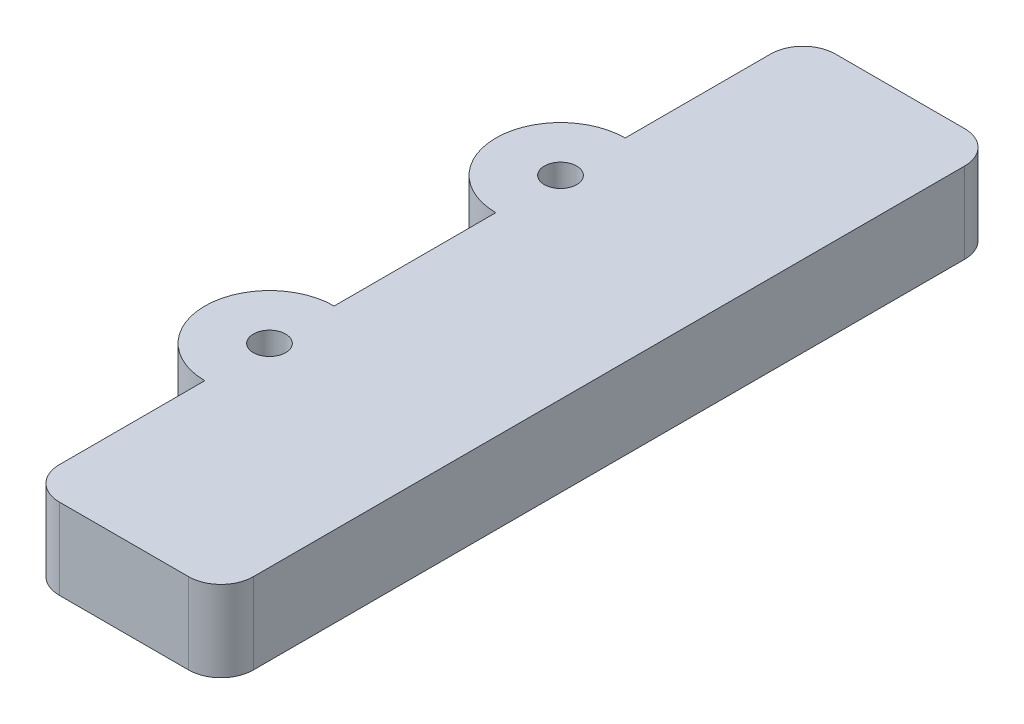
ISO-10303-21;
HEADER;
FILE_DESCRIPTION(('STEP AP214'),'2;1');
FILE_NAME('part.step','',(''),(''),'','','');
FILE_SCHEMA(('AUTOMOTIVE_DESIGN { 1 0 10303 214 1 1 1 1 }'));
ENDSEC;
DATA;
#1=APPLICATION_CONTEXT('core data for automotive mechanical design processes');
#2=APPLICATION_PROTOCOL_DEFINITION('international standard','automotive_design',2000,#1);
#3=PRODUCT_CONTEXT('',#1,'mechanical');
#4=PRODUCT('Part','Part','',(#3));
#5=PRODUCT_RELATED_PRODUCT_CATEGORY('part','',(#4));
#6=PRODUCT_DEFINITION_FORMATION('','',#4);
#7=PRODUCT_DEFINITION_CONTEXT('part definition',#1,'design');
#8=PRODUCT_DEFINITION('design','',#6,#7);
#9=PRODUCT_DEFINITION_SHAPE('','',#8);
#10=(LENGTH_UNIT() NAMED_UNIT(*) SI_UNIT(.MILLI.,.METRE.));
#11=(NAMED_UNIT(*) PLANE_ANGLE_UNIT() SI_UNIT($,.RADIAN.));
#12=(NAMED_UNIT(*) SI_UNIT($,.STERADIAN.) SOLID_ANGLE_UNIT());
#13=UNCERTAINTY_MEASURE_WITH_UNIT(LENGTH_MEASURE(1.E-05),#10,'distance_accuracy_value','');
#14=(GEOMETRIC_REPRESENTATION_CONTEXT(3) GLOBAL_UNCERTAINTY_ASSIGNED_CONTEXT((#13)) GLOBAL_UNIT_ASSIGNED_CONTEXT((#10,
#11,#12)) REPRESENTATION_CONTEXT('',''));
#15=CARTESIAN_POINT('',(0.,0.,0.));
#16=DIRECTION('',(0.,0.,1.));
#17=DIRECTION('',(1.,0.,0.));
#18=AXIS2_PLACEMENT_3D('',#15,#16,#17);
#19=CARTESIAN_POINT('',(0.,5.,-33.));
#20=DIRECTION('',(0.,1.,0.));
#21=DIRECTION('',(0.,0.,1.));
#22=AXIS2_PLACEMENT_3D('',#19,#20,#21);
#23=PLANE('',#22);
#24=CARTESIAN_POINT('',(0.,5.,-33.));
#25=DIRECTION('',(0.,1.,0.));
#26=DIRECTION('',(0.,0.,1.));
#27=AXIS2_PLACEMENT_3D('',#24,#25,#26);
#28=CIRCLE('',#27,1.);
#29=CARTESIAN_POINT('',(0.,5.,-32.));
#30=VERTEX_POINT('',#29);
#31=EDGE_CURVE('E161',#30,#30,#28,.T.);
#32=ORIENTED_EDGE('',*,*,#31,.F.);
#33=EDGE_LOOP('',(#32));
#34=FACE_BOUND('',#33,.T.);
#35=DIRECTION('',(0.,0.,1.));
#36=VECTOR('',#35,1.);
#37=CARTESIAN_POINT('',(0.,5.,0.));
#38=LINE('',#37,#36);
#39=CARTESIAN_POINT('',(0.,5.,-11.));
#40=VERTEX_POINT('',#39);
#41=CARTESIAN_POINT('',(0.,5.,-2.));
#42=VERTEX_POINT('',#41);
#43=EDGE_CURVE('E151',#40,#42,#38,.T.);
#44=ORIENTED_EDGE('',*,*,#43,.T.);
#45=CARTESIAN_POINT('',(2.,5.,-2.));
#46=DIRECTION('',(0.,1.,0.));
#47=DIRECTION('',(0.,0.,1.));
#48=AXIS2_PLACEMENT_3D('',#45,#46,#47);
#49=CIRCLE('',#48,2.);
#50=CARTESIAN_POINT('',(2.,5.,0.));
#51=VERTEX_POINT('',#50);
#52=EDGE_CURVE('E202',#42,#51,#49,.T.);
#53=ORIENTED_EDGE('',*,*,#52,.T.);
#54=DIRECTION('',(1.,0.,0.));
#55=VECTOR('',#54,1.);
#56=CARTESIAN_POINT('',(0.,5.,0.));
#57=LINE('',#56,#55);
#58=CARTESIAN_POINT('',(10.,5.,0.));
#59=VERTEX_POINT('',#58);
#60=EDGE_CURVE('E153',#51,#59,#57,.T.);
#61=ORIENTED_EDGE('',*,*,#60,.T.);
#62=CARTESIAN_POINT('',(10.,5.,-2.));
#63=DIRECTION('',(0.,1.,0.));
#64=DIRECTION('',(0.,0.,1.));
#65=AXIS2_PLACEMENT_3D('',#62,#63,#64);
#66=CIRCLE('',#65,2.);
#67=CARTESIAN_POINT('',(12.,5.,-2.));
#68=VERTEX_POINT('',#67);
#69=EDGE_CURVE('E200',#59,#68,#66,.T.);
#70=ORIENTED_EDGE('',*,*,#69,.T.);
#71=DIRECTION('',(0.,0.,-1.));
#72=VECTOR('',#71,1.);
#73=CARTESIAN_POINT('',(12.,5.,0.));
#74=LINE('',#73,#72);
#75=CARTESIAN_POINT('',(12.,5.,-46.));
#76=VERTEX_POINT('',#75);
#77=EDGE_CURVE('E176',#68,#76,#74,.T.);
#78=ORIENTED_EDGE('',*,*,#77,.T.);
#79=CARTESIAN_POINT('',(10.,5.,-46.));
#80=DIRECTION('',(0.,1.,0.));
#81=DIRECTION('',(0.,0.,1.));
#82=AXIS2_PLACEMENT_3D('',#79,#80,#81);
#83=CIRCLE('',#82,2.);
#84=CARTESIAN_POINT('',(10.,5.,-48.));
#85=VERTEX_POINT('',#84);
#86=EDGE_CURVE('E197',#76,#85,#83,.T.);
#87=ORIENTED_EDGE('',*,*,#86,.T.);
#88=DIRECTION('',(-1.,0.,0.));
#89=VECTOR('',#88,1.);
#90=CARTESIAN_POINT('',(0.,5.,-48.));
#91=LINE('',#90,#89);
#92=CARTESIAN_POINT('',(2.,5.,-48.));
#93=VERTEX_POINT('',#92);
#94=EDGE_CURVE('E129',#85,#93,#91,.T.);
#95=ORIENTED_EDGE('',*,*,#94,.T.);
#96=CARTESIAN_POINT('',(2.,5.,-46.));
#97=DIRECTION('',(0.,1.,0.));
#98=DIRECTION('',(0.,0.,1.));
#99=AXIS2_PLACEMENT_3D('',#96,#97,#98);
#100=CIRCLE('',#99,2.);
#101=CARTESIAN_POINT('',(0.,5.,-46.));
#102=VERTEX_POINT('',#101);
#103=EDGE_CURVE('E48',#93,#102,#100,.T.);
#104=ORIENTED_EDGE('',*,*,#103,.T.);
#105=DIRECTION('',(0.,0.,1.));
#106=VECTOR('',#105,1.);
#107=CARTESIAN_POINT('',(0.,5.,-37.));
#108=LINE('',#107,#106);
#109=CARTESIAN_POINT('',(0.,5.,-37.));
#110=VERTEX_POINT('',#109);
#111=EDGE_CURVE('E119',#102,#110,#108,.T.);
#112=ORIENTED_EDGE('',*,*,#111,.T.);
#113=CARTESIAN_POINT('',(0.,5.,-33.));
#114=DIRECTION('',(0.,1.,0.));
#115=DIRECTION('',(0.,0.,1.));
#116=AXIS2_PLACEMENT_3D('',#113,#114,#115);
#117=CIRCLE('',#116,4.);
#118=CARTESIAN_POINT('',(0.,5.,-29.));
#119=VERTEX_POINT('',#118);
#120=EDGE_CURVE('E124',#110,#119,#117,.T.);
#121=ORIENTED_EDGE('',*,*,#120,.T.);
#122=DIRECTION('',(0.,0.,1.));
#123=VECTOR('',#122,1.);
#124=CARTESIAN_POINT('',(0.,5.,-19.));
#125=LINE('',#124,#123);
#126=CARTESIAN_POINT('',(0.,5.,-19.));
#127=VERTEX_POINT('',#126);
#128=EDGE_CURVE('E144',#119,#127,#125,.T.);
#129=ORIENTED_EDGE('',*,*,#128,.T.);
#130=CARTESIAN_POINT('',(0.,5.,-15.));
#131=DIRECTION('',(0.,1.,0.));
#132=DIRECTION('',(0.,0.,1.));
#133=AXIS2_PLACEMENT_3D('',#130,#131,#132);
#134=CIRCLE('',#133,4.);
#135=EDGE_CURVE('E146',#127,#40,#134,.T.);
#136=ORIENTED_EDGE('',*,*,#135,.T.);
#137=EDGE_LOOP('',(#44,#53,#61,#70,#78,#87,#95,#104,#112,#121,#129,#136));
#138=FACE_BOUND('',#137,.T.);
#139=CARTESIAN_POINT('',(0.,5.,-15.));
#140=DIRECTION('',(0.,1.,0.));
#141=DIRECTION('',(0.,0.,1.));
#142=AXIS2_PLACEMENT_3D('',#139,#140,#141);
#143=CIRCLE('',#142,1.);
#144=CARTESIAN_POINT('',(0.,5.,-14.));
#145=VERTEX_POINT('',#144);
#146=EDGE_CURVE('E293',#145,#145,#143,.T.);
#147=ORIENTED_EDGE('',*,*,#146,.F.);
#148=EDGE_LOOP('',(#147));
#149=FACE_BOUND('',#148,.T.);
#150=ADVANCED_FACE('F33',(#34,#138,#149),#23,.T.);
#151=CARTESIAN_POINT('',(0.,0.,-33.));
#152=DIRECTION('',(0.,1.,0.));
#153=DIRECTION('',(0.,0.,1.));
#154=AXIS2_PLACEMENT_3D('',#151,#152,#153);
#155=PLANE('',#154);
#156=DIRECTION('',(1.,0.,0.));
#157=VECTOR('',#156,1.);
#158=CARTESIAN_POINT('',(0.,0.,0.));
#159=LINE('',#158,#157);
#160=CARTESIAN_POINT('',(2.,0.,0.));
#161=VERTEX_POINT('',#160);
#162=CARTESIAN_POINT('',(10.,0.,0.));
#163=VERTEX_POINT('',#162);
#164=EDGE_CURVE('E173',#161,#163,#159,.T.);
#165=ORIENTED_EDGE('',*,*,#164,.F.);
#166=CARTESIAN_POINT('',(2.,0.,-2.));
#167=DIRECTION('',(0.,1.,0.));
#168=DIRECTION('',(0.,0.,1.));
#169=AXIS2_PLACEMENT_3D('',#166,#167,#168);
#170=CIRCLE('',#169,2.);
#171=CARTESIAN_POINT('',(0.,0.,-2.));
#172=VERTEX_POINT('',#171);
#173=EDGE_CURVE('E193',#161,#172,#170,.F.);
#174=ORIENTED_EDGE('',*,*,#173,.T.);
#175=DIRECTION('',(0.,0.,1.));
#176=VECTOR('',#175,1.);
#177=CARTESIAN_POINT('',(0.,0.,0.));
#178=LINE('',#177,#176);
#179=CARTESIAN_POINT('',(0.,0.,-11.));
#180=VERTEX_POINT('',#179);
#181=EDGE_CURVE('E170',#180,#172,#178,.T.);
#182=ORIENTED_EDGE('',*,*,#181,.F.);
#183=CARTESIAN_POINT('',(0.,0.,-15.));
#184=DIRECTION('',(0.,1.,0.));
#185=DIRECTION('',(0.,0.,1.));
#186=AXIS2_PLACEMENT_3D('',#183,#184,#185);
#187=CIRCLE('',#186,4.);
#188=CARTESIAN_POINT('',(0.,0.,-19.));
#189=VERTEX_POINT('',#188);
#190=EDGE_CURVE('E168',#189,#180,#187,.T.);
#191=ORIENTED_EDGE('',*,*,#190,.F.);
#192=DIRECTION('',(0.,0.,1.));
#193=VECTOR('',#192,1.);
#194=CARTESIAN_POINT('',(0.,0.,-19.));
#195=LINE('',#194,#193);
#196=CARTESIAN_POINT('',(0.,0.,-29.));
#197=VERTEX_POINT('',#196);
#198=EDGE_CURVE('E166',#197,#189,#195,.T.);
#199=ORIENTED_EDGE('',*,*,#198,.F.);
#200=CARTESIAN_POINT('',(0.,0.,-33.));
#201=DIRECTION('',(0.,1.,0.));
#202=DIRECTION('',(0.,0.,1.));
#203=AXIS2_PLACEMENT_3D('',#200,#201,#202);
#204=CIRCLE('',#203,4.);
#205=CARTESIAN_POINT('',(0.,0.,-37.));
#206=VERTEX_POINT('',#205);
#207=EDGE_CURVE('E164',#206,#197,#204,.T.);
#208=ORIENTED_EDGE('',*,*,#207,.F.);
#209=DIRECTION('',(0.,0.,1.));
#210=VECTOR('',#209,1.);
#211=CARTESIAN_POINT('',(0.,0.,-37.));
#212=LINE('',#211,#210);
#213=CARTESIAN_POINT('',(0.,0.,-46.));
#214=VERTEX_POINT('',#213);
#215=EDGE_CURVE('E135',#214,#206,#212,.T.);
#216=ORIENTED_EDGE('',*,*,#215,.F.);
#217=CARTESIAN_POINT('',(2.,0.,-46.));
#218=DIRECTION('',(0.,1.,0.));
#219=DIRECTION('',(0.,0.,1.));
#220=AXIS2_PLACEMENT_3D('',#217,#218,#219);
#221=CIRCLE('',#220,2.);
#222=CARTESIAN_POINT('',(2.,0.,-48.));
#223=VERTEX_POINT('',#222);
#224=EDGE_CURVE('E189',#214,#223,#221,.F.);
#225=ORIENTED_EDGE('',*,*,#224,.T.);
#226=DIRECTION('',(-1.,0.,0.));
#227=VECTOR('',#226,1.);
#228=CARTESIAN_POINT('',(0.,0.,-48.));
#229=LINE('',#228,#227);
#230=CARTESIAN_POINT('',(10.,0.,-48.));
#231=VERTEX_POINT('',#230);
#232=EDGE_CURVE('E160',#231,#223,#229,.T.);
#233=ORIENTED_EDGE('',*,*,#232,.F.);
#234=CARTESIAN_POINT('',(10.,0.,-46.));
#235=DIRECTION('',(0.,1.,0.));
#236=DIRECTION('',(0.,0.,1.));
#237=AXIS2_PLACEMENT_3D('',#234,#235,#236);
#238=CIRCLE('',#237,2.);
#239=CARTESIAN_POINT('',(12.,0.,-46.));
#240=VERTEX_POINT('',#239);
#241=EDGE_CURVE('E187',#231,#240,#238,.F.);
#242=ORIENTED_EDGE('',*,*,#241,.T.);
#243=DIRECTION('',(0.,0.,-1.));
#244=VECTOR('',#243,1.);
#245=CARTESIAN_POINT('',(12.,0.,0.));
#246=LINE('',#245,#244);
#247=CARTESIAN_POINT('',(12.,0.,-2.));
#248=VERTEX_POINT('',#247);
#249=EDGE_CURVE('E157',#248,#240,#246,.T.);
#250=ORIENTED_EDGE('',*,*,#249,.F.);
#251=CARTESIAN_POINT('',(10.,0.,-2.));
#252=DIRECTION('',(0.,1.,0.));
#253=DIRECTION('',(0.,0.,1.));
#254=AXIS2_PLACEMENT_3D('',#251,#252,#253);
#255=CIRCLE('',#254,2.);
#256=EDGE_CURVE('E191',#248,#163,#255,.F.);
#257=ORIENTED_EDGE('',*,*,#256,.T.);
#258=EDGE_LOOP('',(#165,#174,#182,#191,#199,#208,#216,#225,#233,#242,#250,#257));
#259=FACE_BOUND('',#258,.T.);
#260=CARTESIAN_POINT('',(0.,0.,-33.));
#261=DIRECTION('',(0.,1.,0.));
#262=DIRECTION('',(0.,0.,1.));
#263=AXIS2_PLACEMENT_3D('',#260,#261,#262);
#264=CIRCLE('',#263,1.);
#265=CARTESIAN_POINT('',(0.,0.,-32.));
#266=VERTEX_POINT('',#265);
#267=EDGE_CURVE('E290',#266,#266,#264,.T.);
#268=ORIENTED_EDGE('',*,*,#267,.T.);
#269=EDGE_LOOP('',(#268));
#270=FACE_BOUND('',#269,.T.);
#271=CARTESIAN_POINT('',(0.,0.,-15.));
#272=DIRECTION('',(0.,1.,0.));
#273=DIRECTION('',(0.,0.,1.));
#274=AXIS2_PLACEMENT_3D('',#271,#272,#273);
#275=CIRCLE('',#274,1.);
#276=CARTESIAN_POINT('',(0.,0.,-14.));
#277=VERTEX_POINT('',#276);
#278=EDGE_CURVE('E296',#277,#277,#275,.T.);
#279=ORIENTED_EDGE('',*,*,#278,.T.);
#280=EDGE_LOOP('',(#279));
#281=FACE_BOUND('',#280,.T.);
#282=ADVANCED_FACE('F218',(#259,#270,#281),#155,.F.);
#283=CARTESIAN_POINT('',(12.,5.,0.));
#284=DIRECTION('',(-1.,0.,0.));
#285=DIRECTION('',(0.,0.,1.));
#286=AXIS2_PLACEMENT_3D('',#283,#284,#285);
#287=PLANE('',#286);
#288=ORIENTED_EDGE('',*,*,#77,.F.);
#289=DIRECTION('',(0.,-1.,0.));
#290=VECTOR('',#289,1.);
#291=CARTESIAN_POINT('',(12.,5.,-2.));
#292=LINE('',#291,#290);
#293=EDGE_CURVE('E206',#68,#248,#292,.T.);
#294=ORIENTED_EDGE('',*,*,#293,.T.);
#295=ORIENTED_EDGE('',*,*,#249,.T.);
#296=DIRECTION('',(0.,-1.,0.));
#297=VECTOR('',#296,1.);
#298=CARTESIAN_POINT('',(12.,5.,-46.));
#299=LINE('',#298,#297);
#300=EDGE_CURVE('E204',#240,#76,#299,.F.);
#301=ORIENTED_EDGE('',*,*,#300,.T.);
#302=EDGE_LOOP('',(#288,#294,#295,#301));
#303=FACE_BOUND('',#302,.T.);
#304=ADVANCED_FACE('F238',(#303),#287,.F.);
#305=CARTESIAN_POINT('',(0.,5.,-48.));
#306=DIRECTION('',(0.,0.,1.));
#307=DIRECTION('',(1.,0.,0.));
#308=AXIS2_PLACEMENT_3D('',#305,#306,#307);
#309=PLANE('',#308);
#310=ORIENTED_EDGE('',*,*,#232,.T.);
#311=DIRECTION('',(0.,-1.,0.));
#312=VECTOR('',#311,1.);
#313=CARTESIAN_POINT('',(2.,5.,-48.));
#314=LINE('',#313,#312);
#315=EDGE_CURVE('E11',#223,#93,#314,.F.);
#316=ORIENTED_EDGE('',*,*,#315,.T.);
#317=ORIENTED_EDGE('',*,*,#94,.F.);
#318=DIRECTION('',(0.,-1.,0.));
#319=VECTOR('',#318,1.);
#320=CARTESIAN_POINT('',(10.,5.,-48.));
#321=LINE('',#320,#319);
#322=EDGE_CURVE('E41',#85,#231,#321,.T.);
#323=ORIENTED_EDGE('',*,*,#322,.T.);
#324=EDGE_LOOP('',(#310,#316,#317,#323));
#325=FACE_BOUND('',#324,.T.);
#326=ADVANCED_FACE('F213',(#325),#309,.F.);
#327=CARTESIAN_POINT('',(0.,5.,-37.));
#328=DIRECTION('',(1.,0.,0.));
#329=DIRECTION('',(0.,0.,-1.));
#330=AXIS2_PLACEMENT_3D('',#327,#328,#329);
#331=PLANE('',#330);
#332=ORIENTED_EDGE('',*,*,#111,.F.);
#333=DIRECTION('',(0.,-1.,0.));
#334=VECTOR('',#333,1.);
#335=CARTESIAN_POINT('',(0.,5.,-46.));
#336=LINE('',#335,#334);
#337=EDGE_CURVE('E209',#102,#214,#336,.T.);
#338=ORIENTED_EDGE('',*,*,#337,.T.);
#339=ORIENTED_EDGE('',*,*,#215,.T.);
#340=DIRECTION('',(0.,-1.,0.));
#341=VECTOR('',#340,1.);
#342=CARTESIAN_POINT('',(0.,5.,-37.));
#343=LINE('',#342,#341);
#344=EDGE_CURVE('E132',#110,#206,#343,.T.);
#345=ORIENTED_EDGE('',*,*,#344,.F.);
#346=EDGE_LOOP('',(#332,#338,#339,#345));
#347=FACE_BOUND('',#346,.T.);
#348=ADVANCED_FACE('F133',(#347),#331,.F.);
#349=CARTESIAN_POINT('',(0.,5.,-33.));
#350=DIRECTION('',(0.,-1.,0.));
#351=DIRECTION('',(0.,0.,-1.));
#352=AXIS2_PLACEMENT_3D('',#349,#350,#351);
#353=CYLINDRICAL_SURFACE('',#352,4.);
#354=ORIENTED_EDGE('',*,*,#207,.T.);
#355=DIRECTION('',(0.,-1.,0.));
#356=VECTOR('',#355,1.);
#357=CARTESIAN_POINT('',(0.,5.,-29.));
#358=LINE('',#357,#356);
#359=EDGE_CURVE('E139',#119,#197,#358,.T.);
#360=ORIENTED_EDGE('',*,*,#359,.F.);
#361=ORIENTED_EDGE('',*,*,#120,.F.);
#362=ORIENTED_EDGE('',*,*,#344,.T.);
#363=EDGE_LOOP('',(#354,#360,#361,#362));
#364=FACE_BOUND('',#363,.T.);
#365=ADVANCED_FACE('F141',(#364),#353,.T.);
#366=CARTESIAN_POINT('',(0.,5.,-19.));
#367=DIRECTION('',(1.,0.,0.));
#368=DIRECTION('',(0.,0.,-1.));
#369=AXIS2_PLACEMENT_3D('',#366,#367,#368);
#370=PLANE('',#369);
#371=ORIENTED_EDGE('',*,*,#198,.T.);
#372=DIRECTION('',(0.,-1.,0.));
#373=VECTOR('',#372,1.);
#374=CARTESIAN_POINT('',(0.,5.,-19.));
#375=LINE('',#374,#373);
#376=EDGE_CURVE('E179',#127,#189,#375,.T.);
#377=ORIENTED_EDGE('',*,*,#376,.F.);
#378=ORIENTED_EDGE('',*,*,#128,.F.);
#379=ORIENTED_EDGE('',*,*,#359,.T.);
#380=EDGE_LOOP('',(#371,#377,#378,#379));
#381=FACE_BOUND('',#380,.T.);
#382=ADVANCED_FACE('F256',(#381),#370,.F.);
#383=CARTESIAN_POINT('',(0.,5.,-15.));
#384=DIRECTION('',(0.,-1.,0.));
#385=DIRECTION('',(0.,0.,-1.));
#386=AXIS2_PLACEMENT_3D('',#383,#384,#385);
#387=CYLINDRICAL_SURFACE('',#386,4.);
#388=ORIENTED_EDGE('',*,*,#190,.T.);
#389=DIRECTION('',(0.,-1.,0.));
#390=VECTOR('',#389,1.);
#391=CARTESIAN_POINT('',(0.,5.,-11.));
#392=LINE('',#391,#390);
#393=EDGE_CURVE('E156',#40,#180,#392,.T.);
#394=ORIENTED_EDGE('',*,*,#393,.F.);
#395=ORIENTED_EDGE('',*,*,#135,.F.);
#396=ORIENTED_EDGE('',*,*,#376,.T.);
#397=EDGE_LOOP('',(#388,#394,#395,#396));
#398=FACE_BOUND('',#397,.T.);
#399=ADVANCED_FACE('F252',(#398),#387,.T.);
#400=CARTESIAN_POINT('',(0.,5.,0.));
#401=DIRECTION('',(1.,0.,0.));
#402=DIRECTION('',(0.,0.,-1.));
#403=AXIS2_PLACEMENT_3D('',#400,#401,#402);
#404=PLANE('',#403);
#405=ORIENTED_EDGE('',*,*,#181,.T.);
#406=DIRECTION('',(0.,-1.,0.));
#407=VECTOR('',#406,1.);
#408=CARTESIAN_POINT('',(0.,5.,-2.));
#409=LINE('',#408,#407);
#410=EDGE_CURVE('E195',#172,#42,#409,.F.);
#411=ORIENTED_EDGE('',*,*,#410,.T.);
#412=ORIENTED_EDGE('',*,*,#43,.F.);
#413=ORIENTED_EDGE('',*,*,#393,.T.);
#414=EDGE_LOOP('',(#405,#411,#412,#413));
#415=FACE_BOUND('',#414,.T.);
#416=ADVANCED_FACE('F248',(#415),#404,.F.);
#417=CARTESIAN_POINT('',(0.,5.,0.));
#418=DIRECTION('',(0.,0.,-1.));
#419=DIRECTION('',(-1.,0.,0.));
#420=AXIS2_PLACEMENT_3D('',#417,#418,#419);
#421=PLANE('',#420);
#422=ORIENTED_EDGE('',*,*,#60,.F.);
#423=DIRECTION('',(0.,-1.,0.));
#424=VECTOR('',#423,1.);
#425=CARTESIAN_POINT('',(2.,5.,0.));
#426=LINE('',#425,#424);
#427=EDGE_CURVE('E184',#51,#161,#426,.T.);
#428=ORIENTED_EDGE('',*,*,#427,.T.);
#429=ORIENTED_EDGE('',*,*,#164,.T.);
#430=DIRECTION('',(0.,-1.,0.));
#431=VECTOR('',#430,1.);
#432=CARTESIAN_POINT('',(10.,5.,0.));
#433=LINE('',#432,#431);
#434=EDGE_CURVE('E138',#163,#59,#433,.F.);
#435=ORIENTED_EDGE('',*,*,#434,.T.);
#436=EDGE_LOOP('',(#422,#428,#429,#435));
#437=FACE_BOUND('',#436,.T.);
#438=ADVANCED_FACE('F245',(#437),#421,.F.);
#439=CARTESIAN_POINT('',(0.,5.,-33.));
#440=DIRECTION('',(0.,-1.,0.));
#441=DIRECTION('',(0.,0.,-1.));
#442=AXIS2_PLACEMENT_3D('',#439,#440,#441);
#443=CYLINDRICAL_SURFACE('',#442,1.);
#444=ORIENTED_EDGE('',*,*,#31,.T.);
#445=EDGE_LOOP('',(#444));
#446=FACE_BOUND('',#445,.T.);
#447=ORIENTED_EDGE('',*,*,#267,.F.);
#448=EDGE_LOOP('',(#447));
#449=FACE_BOUND('',#448,.T.);
#450=ADVANCED_FACE('F242',(#446,#449),#443,.F.);
#451=CARTESIAN_POINT('',(0.,5.,-15.));
#452=DIRECTION('',(0.,-1.,0.));
#453=DIRECTION('',(0.,0.,-1.));
#454=AXIS2_PLACEMENT_3D('',#451,#452,#453);
#455=CYLINDRICAL_SURFACE('',#454,1.);
#456=ORIENTED_EDGE('',*,*,#146,.T.);
#457=EDGE_LOOP('',(#456));
#458=FACE_BOUND('',#457,.T.);
#459=ORIENTED_EDGE('',*,*,#278,.F.);
#460=EDGE_LOOP('',(#459));
#461=FACE_BOUND('',#460,.T.);
#462=ADVANCED_FACE('F271',(#458,#461),#455,.F.);
#463=CARTESIAN_POINT('',(2.,5.,-2.));
#464=DIRECTION('',(0.,-1.,0.));
#465=DIRECTION('',(0.,0.,-1.));
#466=AXIS2_PLACEMENT_3D('',#463,#464,#465);
#467=CYLINDRICAL_SURFACE('',#466,2.);
#468=ORIENTED_EDGE('',*,*,#52,.F.);
#469=ORIENTED_EDGE('',*,*,#410,.F.);
#470=ORIENTED_EDGE('',*,*,#173,.F.);
#471=ORIENTED_EDGE('',*,*,#427,.F.);
#472=EDGE_LOOP('',(#468,#469,#470,#471));
#473=FACE_BOUND('',#472,.T.);
#474=ADVANCED_FACE('F229',(#473),#467,.T.);
#475=CARTESIAN_POINT('',(10.,5.,-2.));
#476=DIRECTION('',(0.,-1.,0.));
#477=DIRECTION('',(0.,0.,-1.));
#478=AXIS2_PLACEMENT_3D('',#475,#476,#477);
#479=CYLINDRICAL_SURFACE('',#478,2.);
#480=ORIENTED_EDGE('',*,*,#69,.F.);
#481=ORIENTED_EDGE('',*,*,#434,.F.);
#482=ORIENTED_EDGE('',*,*,#256,.F.);
#483=ORIENTED_EDGE('',*,*,#293,.F.);
#484=EDGE_LOOP('',(#480,#481,#482,#483));
#485=FACE_BOUND('',#484,.T.);
#486=ADVANCED_FACE('F224',(#485),#479,.T.);
#487=CARTESIAN_POINT('',(2.,5.,-46.));
#488=DIRECTION('',(0.,-1.,0.));
#489=DIRECTION('',(0.,0.,-1.));
#490=AXIS2_PLACEMENT_3D('',#487,#488,#489);
#491=CYLINDRICAL_SURFACE('',#490,2.);
#492=ORIENTED_EDGE('',*,*,#103,.F.);
#493=ORIENTED_EDGE('',*,*,#315,.F.);
#494=ORIENTED_EDGE('',*,*,#224,.F.);
#495=ORIENTED_EDGE('',*,*,#337,.F.);
#496=EDGE_LOOP('',(#492,#493,#494,#495));
#497=FACE_BOUND('',#496,.T.);
#498=ADVANCED_FACE('F222',(#497),#491,.T.);
#499=CARTESIAN_POINT('',(10.,5.,-46.));
#500=DIRECTION('',(0.,-1.,0.));
#501=DIRECTION('',(0.,0.,-1.));
#502=AXIS2_PLACEMENT_3D('',#499,#500,#501);
#503=CYLINDRICAL_SURFACE('',#502,2.);
#504=ORIENTED_EDGE('',*,*,#86,.F.);
#505=ORIENTED_EDGE('',*,*,#300,.F.);
#506=ORIENTED_EDGE('',*,*,#241,.F.);
#507=ORIENTED_EDGE('',*,*,#322,.F.);
#508=EDGE_LOOP('',(#504,#505,#506,#507));
#509=FACE_BOUND('',#508,.T.);
#510=ADVANCED_FACE('F35',(#509),#503,.T.);
#511=CLOSED_SHELL('',(#150,#282,#304,#326,#348,#365,#382,#399,#416,#438,#450,#462,#474,#486,
#498,#510));
#512=MANIFOLD_SOLID_BREP('B2',#511);
#513=ADVANCED_BREP_SHAPE_REPRESENTATION('',(#18,#512),#14);
#514=SHAPE_DEFINITION_REPRESENTATION(#9,#513);
ENDSEC;
END-ISO-10303-21;
